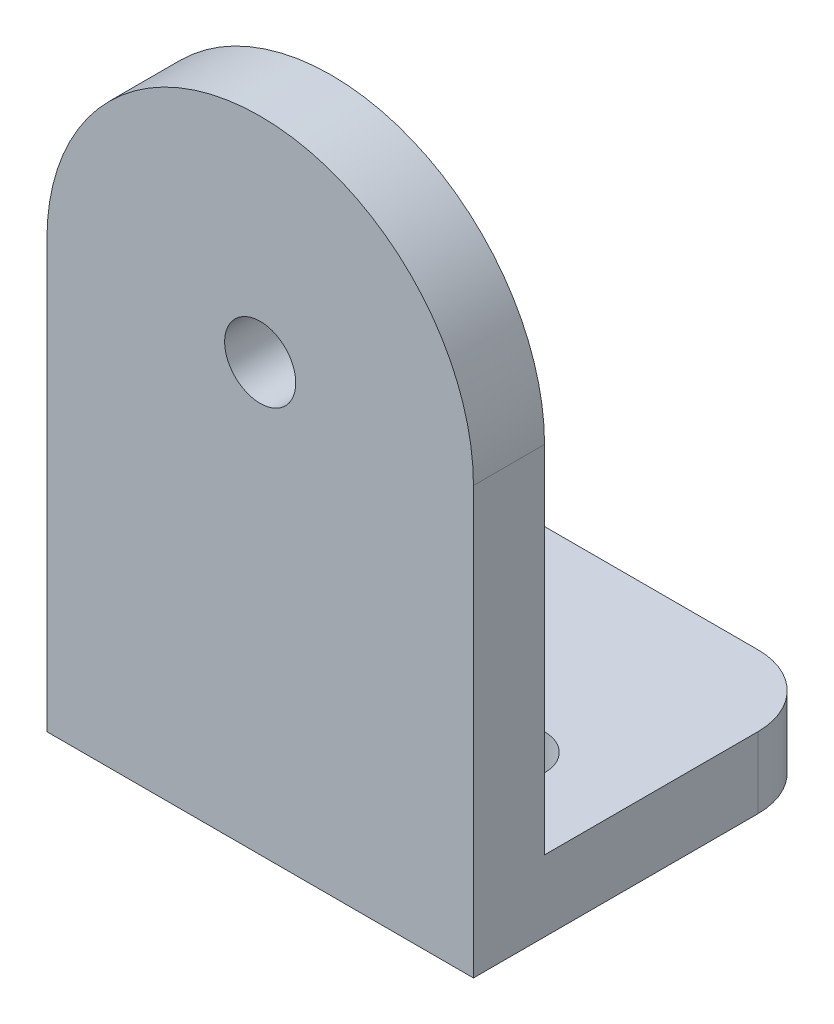
ISO-10303-21;
HEADER;
FILE_DESCRIPTION(('STEP AP214'),'2;1');
FILE_NAME('part.step','',(''),(''),'','','');
FILE_SCHEMA(('AUTOMOTIVE_DESIGN { 1 0 10303 214 1 1 1 1 }'));
ENDSEC;
DATA;
#1=APPLICATION_CONTEXT('core data for automotive mechanical design processes');
#2=APPLICATION_PROTOCOL_DEFINITION('international standard','automotive_design',2000,#1);
#3=PRODUCT_CONTEXT('',#1,'mechanical');
#4=PRODUCT('Part','Part','',(#3));
#5=PRODUCT_RELATED_PRODUCT_CATEGORY('part','',(#4));
#6=PRODUCT_DEFINITION_FORMATION('','',#4);
#7=PRODUCT_DEFINITION_CONTEXT('part definition',#1,'design');
#8=PRODUCT_DEFINITION('design','',#6,#7);
#9=PRODUCT_DEFINITION_SHAPE('','',#8);
#10=(LENGTH_UNIT() NAMED_UNIT(*) SI_UNIT(.MILLI.,.METRE.));
#11=(NAMED_UNIT(*) PLANE_ANGLE_UNIT() SI_UNIT($,.RADIAN.));
#12=(NAMED_UNIT(*) SI_UNIT($,.STERADIAN.) SOLID_ANGLE_UNIT());
#13=UNCERTAINTY_MEASURE_WITH_UNIT(LENGTH_MEASURE(1.E-05),#10,'distance_accuracy_value','');
#14=(GEOMETRIC_REPRESENTATION_CONTEXT(3) GLOBAL_UNCERTAINTY_ASSIGNED_CONTEXT((#13)) GLOBAL_UNIT_ASSIGNED_CONTEXT((#10,
#11,#12)) REPRESENTATION_CONTEXT('',''));
#15=CARTESIAN_POINT('',(0.,0.,0.));
#16=DIRECTION('',(0.,0.,1.));
#17=DIRECTION('',(1.,0.,0.));
#18=AXIS2_PLACEMENT_3D('',#15,#16,#17);
#19=CARTESIAN_POINT('',(-15.9497199849818,7.3015274319225,25.));
#20=DIRECTION('',(0.,0.,1.));
#21=DIRECTION('',(1.,0.,0.));
#22=AXIS2_PLACEMENT_3D('',#19,#20,#21);
#23=PLANE('',#22);
#24=CARTESIAN_POINT('',(-15.9497199849818,7.3015274319225,25.));
#25=DIRECTION('',(0.,0.,1.));
#26=DIRECTION('',(1.,0.,0.));
#27=AXIS2_PLACEMENT_3D('',#24,#25,#26);
#28=CIRCLE('',#27,15.);
#29=CARTESIAN_POINT('',(-0.949719984981778,7.3015274319225,25.));
#30=VERTEX_POINT('',#29);
#31=CARTESIAN_POINT('',(-30.9497199849818,7.3015274319225,25.));
#32=VERTEX_POINT('',#31);
#33=EDGE_CURVE('E146',#30,#32,#28,.T.);
#34=ORIENTED_EDGE('',*,*,#33,.T.);
#35=DIRECTION('',(0.,-1.,0.));
#36=VECTOR('',#35,1.);
#37=CARTESIAN_POINT('',(-30.9497199849818,7.3015274319225,25.));
#38=LINE('',#37,#36);
#39=CARTESIAN_POINT('',(-30.9497199849818,-22.6984725680775,25.));
#40=VERTEX_POINT('',#39);
#41=EDGE_CURVE('E150',#32,#40,#38,.T.);
#42=ORIENTED_EDGE('',*,*,#41,.T.);
#43=DIRECTION('',(1.,0.,0.));
#44=VECTOR('',#43,1.);
#45=CARTESIAN_POINT('',(-30.9497199849818,-22.6984725680775,25.));
#46=LINE('',#45,#44);
#47=CARTESIAN_POINT('',(-0.949719984981778,-22.6984725680775,25.));
#48=VERTEX_POINT('',#47);
#49=EDGE_CURVE('E153',#40,#48,#46,.T.);
#50=ORIENTED_EDGE('',*,*,#49,.T.);
#51=DIRECTION('',(0.,1.,0.));
#52=VECTOR('',#51,1.);
#53=CARTESIAN_POINT('',(-0.949719984981778,-22.6984725680775,25.));
#54=LINE('',#53,#52);
#55=EDGE_CURVE('E156',#48,#30,#54,.T.);
#56=ORIENTED_EDGE('',*,*,#55,.T.);
#57=EDGE_LOOP('',(#34,#42,#50,#56));
#58=FACE_BOUND('',#57,.T.);
#59=CARTESIAN_POINT('',(-15.9497199849818,7.3015274319225,25.));
#60=DIRECTION('',(0.,0.,1.));
#61=DIRECTION('',(1.,0.,0.));
#62=AXIS2_PLACEMENT_3D('',#59,#60,#61);
#63=CIRCLE('',#62,2.5);
#64=CARTESIAN_POINT('',(-13.4497199849818,7.3015274319225,25.));
#65=VERTEX_POINT('',#64);
#66=EDGE_CURVE('E119',#65,#65,#63,.T.);
#67=ORIENTED_EDGE('',*,*,#66,.F.);
#68=EDGE_LOOP('',(#67));
#69=FACE_BOUND('',#68,.T.);
#70=ADVANCED_FACE('F41',(#58,#69),#23,.T.);
#71=CARTESIAN_POINT('',(-15.9497199849818,7.3015274319225,0.));
#72=DIRECTION('',(0.,0.,1.));
#73=DIRECTION('',(1.,0.,0.));
#74=AXIS2_PLACEMENT_3D('',#71,#72,#73);
#75=PLANE('',#74);
#76=DIRECTION('',(1.,0.,0.));
#77=VECTOR('',#76,1.);
#78=CARTESIAN_POINT('',(-30.9497199849818,-22.6984725680775,0.));
#79=LINE('',#78,#77);
#80=CARTESIAN_POINT('',(-25.9497199849818,-22.6984725680775,0.));
#81=VERTEX_POINT('',#80);
#82=CARTESIAN_POINT('',(-5.94971998498179,-22.6984725680775,0.));
#83=VERTEX_POINT('',#82);
#84=EDGE_CURVE('E145',#81,#83,#79,.T.);
#85=ORIENTED_EDGE('',*,*,#84,.F.);
#86=DIRECTION('',(0.,-1.,0.));
#87=VECTOR('',#86,1.);
#88=CARTESIAN_POINT('',(-25.9497199849818,7.3015274319225,0.));
#89=LINE('',#88,#87);
#90=CARTESIAN_POINT('',(-25.9497199849818,-17.6984725680775,0.));
#91=VERTEX_POINT('',#90);
#92=EDGE_CURVE('E195',#81,#91,#89,.F.);
#93=ORIENTED_EDGE('',*,*,#92,.T.);
#94=DIRECTION('',(1.,0.,0.));
#95=VECTOR('',#94,1.);
#96=CARTESIAN_POINT('',(-47.,-17.6984725680775,0.));
#97=LINE('',#96,#95);
#98=CARTESIAN_POINT('',(-5.94971998498178,-17.6984725680775,0.));
#99=VERTEX_POINT('',#98);
#100=EDGE_CURVE('E128',#91,#99,#97,.T.);
#101=ORIENTED_EDGE('',*,*,#100,.T.);
#102=DIRECTION('',(0.,1.,0.));
#103=VECTOR('',#102,1.);
#104=CARTESIAN_POINT('',(-5.94971998498178,7.3015274319225,0.));
#105=LINE('',#104,#103);
#106=EDGE_CURVE('E192',#99,#83,#105,.F.);
#107=ORIENTED_EDGE('',*,*,#106,.T.);
#108=EDGE_LOOP('',(#85,#93,#101,#107));
#109=FACE_BOUND('',#108,.T.);
#110=ADVANCED_FACE('F238',(#109),#75,.F.);
#111=CARTESIAN_POINT('',(-15.9497199849818,7.3015274319225,25.));
#112=DIRECTION('',(0.,0.,-1.));
#113=DIRECTION('',(-1.,0.,0.));
#114=AXIS2_PLACEMENT_3D('',#111,#112,#113);
#115=CYLINDRICAL_SURFACE('',#114,15.);
#116=DIRECTION('',(0.,0.,-1.));
#117=VECTOR('',#116,1.);
#118=CARTESIAN_POINT('',(-0.949719984981778,7.3015274319225,25.));
#119=LINE('',#118,#117);
#120=CARTESIAN_POINT('',(-0.949719984981778,7.3015274319225,20.));
#121=VERTEX_POINT('',#120);
#122=EDGE_CURVE('E159',#30,#121,#119,.T.);
#123=ORIENTED_EDGE('',*,*,#122,.T.);
#124=CARTESIAN_POINT('',(-15.9497199849818,7.3015274319225,20.));
#125=DIRECTION('',(0.,0.,1.));
#126=DIRECTION('',(1.,0.,0.));
#127=AXIS2_PLACEMENT_3D('',#124,#125,#126);
#128=CIRCLE('',#127,15.);
#129=CARTESIAN_POINT('',(-30.9497199849818,7.3015274319225,20.));
#130=VERTEX_POINT('',#129);
#131=EDGE_CURVE('E136',#121,#130,#128,.T.);
#132=ORIENTED_EDGE('',*,*,#131,.T.);
#133=DIRECTION('',(0.,0.,-1.));
#134=VECTOR('',#133,1.);
#135=CARTESIAN_POINT('',(-30.9497199849818,7.3015274319225,25.));
#136=LINE('',#135,#134);
#137=EDGE_CURVE('E134',#32,#130,#136,.T.);
#138=ORIENTED_EDGE('',*,*,#137,.F.);
#139=ORIENTED_EDGE('',*,*,#33,.F.);
#140=EDGE_LOOP('',(#123,#132,#138,#139));
#141=FACE_BOUND('',#140,.T.);
#142=ADVANCED_FACE('F226',(#141),#115,.T.);
#143=CARTESIAN_POINT('',(-30.9497199849818,7.3015274319225,25.));
#144=DIRECTION('',(1.,0.,0.));
#145=DIRECTION('',(0.,0.,-1.));
#146=AXIS2_PLACEMENT_3D('',#143,#144,#145);
#147=PLANE('',#146);
#148=DIRECTION('',(0.,0.,-1.));
#149=VECTOR('',#148,1.);
#150=CARTESIAN_POINT('',(-30.9497199849818,-17.6984725680775,25.));
#151=LINE('',#150,#149);
#152=CARTESIAN_POINT('',(-30.9497199849818,-17.6984725680775,20.));
#153=VERTEX_POINT('',#152);
#154=CARTESIAN_POINT('',(-30.9497199849818,-17.6984725680775,5.));
#155=VERTEX_POINT('',#154);
#156=EDGE_CURVE('E108',#153,#155,#151,.T.);
#157=ORIENTED_EDGE('',*,*,#156,.T.);
#158=DIRECTION('',(0.,-1.,0.));
#159=VECTOR('',#158,1.);
#160=CARTESIAN_POINT('',(-30.9497199849818,7.3015274319225,5.));
#161=LINE('',#160,#159);
#162=CARTESIAN_POINT('',(-30.9497199849818,-22.6984725680775,5.));
#163=VERTEX_POINT('',#162);
#164=EDGE_CURVE('E183',#155,#163,#161,.T.);
#165=ORIENTED_EDGE('',*,*,#164,.T.);
#166=DIRECTION('',(0.,0.,-1.));
#167=VECTOR('',#166,1.);
#168=CARTESIAN_POINT('',(-30.9497199849818,-22.6984725680775,25.));
#169=LINE('',#168,#167);
#170=EDGE_CURVE('E170',#40,#163,#169,.T.);
#171=ORIENTED_EDGE('',*,*,#170,.F.);
#172=ORIENTED_EDGE('',*,*,#41,.F.);
#173=ORIENTED_EDGE('',*,*,#137,.T.);
#174=DIRECTION('',(0.,-1.,0.));
#175=VECTOR('',#174,1.);
#176=CARTESIAN_POINT('',(-30.9497199849818,7.3015274319225,20.));
#177=LINE('',#176,#175);
#178=EDGE_CURVE('E120',#130,#153,#177,.T.);
#179=ORIENTED_EDGE('',*,*,#178,.T.);
#180=EDGE_LOOP('',(#157,#165,#171,#172,#173,#179));
#181=FACE_BOUND('',#180,.T.);
#182=ADVANCED_FACE('F132',(#181),#147,.F.);
#183=CARTESIAN_POINT('',(-30.9497199849818,-22.6984725680775,25.));
#184=DIRECTION('',(0.,1.,0.));
#185=DIRECTION('',(0.,0.,1.));
#186=AXIS2_PLACEMENT_3D('',#183,#184,#185);
#187=PLANE('',#186);
#188=CARTESIAN_POINT('',(-23.4497199849818,-22.6984725680775,15.));
#189=DIRECTION('',(0.,1.,0.));
#190=DIRECTION('',(0.,0.,1.));
#191=AXIS2_PLACEMENT_3D('',#188,#189,#190);
#192=CIRCLE('',#191,2.5);
#193=CARTESIAN_POINT('',(-23.4497199849818,-22.6984725680775,17.5));
#194=VERTEX_POINT('',#193);
#195=EDGE_CURVE('E129',#194,#194,#192,.T.);
#196=ORIENTED_EDGE('',*,*,#195,.T.);
#197=EDGE_LOOP('',(#196));
#198=FACE_BOUND('',#197,.T.);
#199=CARTESIAN_POINT('',(-8.44971998498178,-22.6984725680775,15.));
#200=DIRECTION('',(0.,1.,0.));
#201=DIRECTION('',(0.,0.,1.));
#202=AXIS2_PLACEMENT_3D('',#199,#200,#201);
#203=CIRCLE('',#202,2.5);
#204=CARTESIAN_POINT('',(-8.44971998498178,-22.6984725680775,17.5));
#205=VERTEX_POINT('',#204);
#206=EDGE_CURVE('E204',#205,#205,#203,.T.);
#207=ORIENTED_EDGE('',*,*,#206,.T.);
#208=EDGE_LOOP('',(#207));
#209=FACE_BOUND('',#208,.T.);
#210=ORIENTED_EDGE('',*,*,#170,.T.);
#211=CARTESIAN_POINT('',(-25.9497199849818,-22.6984725680775,5.));
#212=DIRECTION('',(0.,1.,0.));
#213=DIRECTION('',(0.,0.,1.));
#214=AXIS2_PLACEMENT_3D('',#211,#212,#213);
#215=CIRCLE('',#214,5.);
#216=EDGE_CURVE('E189',#163,#81,#215,.F.);
#217=ORIENTED_EDGE('',*,*,#216,.T.);
#218=ORIENTED_EDGE('',*,*,#84,.T.);
#219=CARTESIAN_POINT('',(-5.94971998498178,-22.6984725680775,5.));
#220=DIRECTION('',(0.,1.,0.));
#221=DIRECTION('',(0.,0.,1.));
#222=AXIS2_PLACEMENT_3D('',#219,#220,#221);
#223=CIRCLE('',#222,5.);
#224=CARTESIAN_POINT('',(-0.949719984981778,-22.6984725680775,5.));
#225=VERTEX_POINT('',#224);
#226=EDGE_CURVE('E186',#83,#225,#223,.F.);
#227=ORIENTED_EDGE('',*,*,#226,.T.);
#228=DIRECTION('',(0.,0.,-1.));
#229=VECTOR('',#228,1.);
#230=CARTESIAN_POINT('',(-0.949719984981778,-22.6984725680775,25.));
#231=LINE('',#230,#229);
#232=EDGE_CURVE('E166',#48,#225,#231,.T.);
#233=ORIENTED_EDGE('',*,*,#232,.F.);
#234=ORIENTED_EDGE('',*,*,#49,.F.);
#235=EDGE_LOOP('',(#210,#217,#218,#227,#233,#234));
#236=FACE_BOUND('',#235,.T.);
#237=ADVANCED_FACE('F234',(#198,#209,#236),#187,.F.);
#238=CARTESIAN_POINT('',(-0.949719984981778,-22.6984725680775,25.));
#239=DIRECTION('',(-1.,0.,0.));
#240=DIRECTION('',(0.,0.,1.));
#241=AXIS2_PLACEMENT_3D('',#238,#239,#240);
#242=PLANE('',#241);
#243=ORIENTED_EDGE('',*,*,#232,.T.);
#244=DIRECTION('',(0.,1.,0.));
#245=VECTOR('',#244,1.);
#246=CARTESIAN_POINT('',(-0.949719984981778,-22.6984725680775,5.));
#247=LINE('',#246,#245);
#248=CARTESIAN_POINT('',(-0.949719984981778,-17.6984725680775,5.));
#249=VERTEX_POINT('',#248);
#250=EDGE_CURVE('E11',#225,#249,#247,.T.);
#251=ORIENTED_EDGE('',*,*,#250,.T.);
#252=DIRECTION('',(0.,0.,1.));
#253=VECTOR('',#252,1.);
#254=CARTESIAN_POINT('',(-0.949719984981778,-17.6984725680775,25.));
#255=LINE('',#254,#253);
#256=CARTESIAN_POINT('',(-0.949719984981778,-17.6984725680775,20.));
#257=VERTEX_POINT('',#256);
#258=EDGE_CURVE('E176',#249,#257,#255,.T.);
#259=ORIENTED_EDGE('',*,*,#258,.T.);
#260=DIRECTION('',(0.,1.,0.));
#261=VECTOR('',#260,1.);
#262=CARTESIAN_POINT('',(-0.949719984981778,-22.6984725680775,20.));
#263=LINE('',#262,#261);
#264=EDGE_CURVE('E126',#257,#121,#263,.T.);
#265=ORIENTED_EDGE('',*,*,#264,.T.);
#266=ORIENTED_EDGE('',*,*,#122,.F.);
#267=ORIENTED_EDGE('',*,*,#55,.F.);
#268=EDGE_LOOP('',(#243,#251,#259,#265,#266,#267));
#269=FACE_BOUND('',#268,.T.);
#270=ADVANCED_FACE('F222',(#269),#242,.F.);
#271=CARTESIAN_POINT('',(-15.9497199849818,7.3015274319225,25.));
#272=DIRECTION('',(0.,0.,-1.));
#273=DIRECTION('',(-1.,0.,0.));
#274=AXIS2_PLACEMENT_3D('',#271,#272,#273);
#275=CYLINDRICAL_SURFACE('',#274,2.5);
#276=CARTESIAN_POINT('',(-15.9497199849818,7.3015274319225,20.));
#277=DIRECTION('',(0.,0.,1.));
#278=DIRECTION('',(1.,0.,0.));
#279=AXIS2_PLACEMENT_3D('',#276,#277,#278);
#280=CIRCLE('',#279,2.5);
#281=CARTESIAN_POINT('',(-13.4497199849818,7.3015274319225,20.));
#282=VERTEX_POINT('',#281);
#283=EDGE_CURVE('E177',#282,#282,#280,.T.);
#284=ORIENTED_EDGE('',*,*,#283,.F.);
#285=EDGE_LOOP('',(#284));
#286=FACE_BOUND('',#285,.T.);
#287=ORIENTED_EDGE('',*,*,#66,.T.);
#288=EDGE_LOOP('',(#287));
#289=FACE_BOUND('',#288,.T.);
#290=ADVANCED_FACE('F257',(#286,#289),#275,.F.);
#291=CARTESIAN_POINT('',(-47.,-17.6984725680775,20.));
#292=DIRECTION('',(0.,-1.,0.));
#293=DIRECTION('',(0.,0.,-1.));
#294=AXIS2_PLACEMENT_3D('',#291,#292,#293);
#295=PLANE('',#294);
#296=CARTESIAN_POINT('',(-23.4497199849818,-17.6984725680775,15.));
#297=DIRECTION('',(0.,-1.,0.));
#298=DIRECTION('',(0.,0.,-1.));
#299=AXIS2_PLACEMENT_3D('',#296,#297,#298);
#300=CIRCLE('',#299,2.5);
#301=CARTESIAN_POINT('',(-23.4497199849818,-17.6984725680775,12.5));
#302=VERTEX_POINT('',#301);
#303=EDGE_CURVE('E45',#302,#302,#300,.T.);
#304=ORIENTED_EDGE('',*,*,#303,.T.);
#305=EDGE_LOOP('',(#304));
#306=FACE_BOUND('',#305,.T.);
#307=CARTESIAN_POINT('',(-8.44971998498178,-17.6984725680775,15.));
#308=DIRECTION('',(0.,-1.,0.));
#309=DIRECTION('',(0.,0.,-1.));
#310=AXIS2_PLACEMENT_3D('',#307,#308,#309);
#311=CIRCLE('',#310,2.5);
#312=CARTESIAN_POINT('',(-8.44971998498178,-17.6984725680775,12.5));
#313=VERTEX_POINT('',#312);
#314=EDGE_CURVE('E201',#313,#313,#311,.T.);
#315=ORIENTED_EDGE('',*,*,#314,.T.);
#316=EDGE_LOOP('',(#315));
#317=FACE_BOUND('',#316,.T.);
#318=ORIENTED_EDGE('',*,*,#100,.F.);
#319=CARTESIAN_POINT('',(-25.9497199849818,-17.6984725680775,5.));
#320=DIRECTION('',(0.,-1.,0.));
#321=DIRECTION('',(0.,0.,-1.));
#322=AXIS2_PLACEMENT_3D('',#319,#320,#321);
#323=CIRCLE('',#322,5.);
#324=EDGE_CURVE('E51',#91,#155,#323,.F.);
#325=ORIENTED_EDGE('',*,*,#324,.T.);
#326=ORIENTED_EDGE('',*,*,#156,.F.);
#327=DIRECTION('',(1.,0.,0.));
#328=VECTOR('',#327,1.);
#329=CARTESIAN_POINT('',(-47.,-17.6984725680775,20.));
#330=LINE('',#329,#328);
#331=EDGE_CURVE('E111',#153,#257,#330,.T.);
#332=ORIENTED_EDGE('',*,*,#331,.T.);
#333=ORIENTED_EDGE('',*,*,#258,.F.);
#334=CARTESIAN_POINT('',(-5.94971998498178,-17.6984725680775,5.));
#335=DIRECTION('',(0.,-1.,0.));
#336=DIRECTION('',(0.,0.,-1.));
#337=AXIS2_PLACEMENT_3D('',#334,#335,#336);
#338=CIRCLE('',#337,5.);
#339=EDGE_CURVE('E59',#249,#99,#338,.F.);
#340=ORIENTED_EDGE('',*,*,#339,.T.);
#341=EDGE_LOOP('',(#318,#325,#326,#332,#333,#340));
#342=FACE_BOUND('',#341,.T.);
#343=ADVANCED_FACE('F110',(#306,#317,#342),#295,.F.);
#344=CARTESIAN_POINT('',(-47.,-17.6984725680775,20.));
#345=DIRECTION('',(0.,0.,1.));
#346=DIRECTION('',(1.,0.,0.));
#347=AXIS2_PLACEMENT_3D('',#344,#345,#346);
#348=PLANE('',#347);
#349=ORIENTED_EDGE('',*,*,#283,.T.);
#350=EDGE_LOOP('',(#349));
#351=FACE_BOUND('',#350,.T.);
#352=ORIENTED_EDGE('',*,*,#131,.F.);
#353=ORIENTED_EDGE('',*,*,#264,.F.);
#354=ORIENTED_EDGE('',*,*,#331,.F.);
#355=ORIENTED_EDGE('',*,*,#178,.F.);
#356=EDGE_LOOP('',(#352,#353,#354,#355));
#357=FACE_BOUND('',#356,.T.);
#358=ADVANCED_FACE('F123',(#351,#357),#348,.F.);
#359=CARTESIAN_POINT('',(-25.9497199849818,7.3015274319225,5.));
#360=DIRECTION('',(0.,-1.,0.));
#361=DIRECTION('',(0.,0.,-1.));
#362=AXIS2_PLACEMENT_3D('',#359,#360,#361);
#363=CYLINDRICAL_SURFACE('',#362,5.);
#364=ORIENTED_EDGE('',*,*,#324,.F.);
#365=ORIENTED_EDGE('',*,*,#92,.F.);
#366=ORIENTED_EDGE('',*,*,#216,.F.);
#367=ORIENTED_EDGE('',*,*,#164,.F.);
#368=EDGE_LOOP('',(#364,#365,#366,#367));
#369=FACE_BOUND('',#368,.T.);
#370=ADVANCED_FACE('F240',(#369),#363,.T.);
#371=CARTESIAN_POINT('',(-5.94971998498178,-22.6984725680775,5.));
#372=DIRECTION('',(0.,1.,0.));
#373=DIRECTION('',(0.,0.,1.));
#374=AXIS2_PLACEMENT_3D('',#371,#372,#373);
#375=CYLINDRICAL_SURFACE('',#374,5.);
#376=ORIENTED_EDGE('',*,*,#226,.F.);
#377=ORIENTED_EDGE('',*,*,#106,.F.);
#378=ORIENTED_EDGE('',*,*,#339,.F.);
#379=ORIENTED_EDGE('',*,*,#250,.F.);
#380=EDGE_LOOP('',(#376,#377,#378,#379));
#381=FACE_BOUND('',#380,.T.);
#382=ADVANCED_FACE('F43',(#381),#375,.T.);
#383=CARTESIAN_POINT('',(-8.44971998498178,-47.,15.));
#384=DIRECTION('',(0.,1.,0.));
#385=DIRECTION('',(0.,0.,1.));
#386=AXIS2_PLACEMENT_3D('',#383,#384,#385);
#387=CYLINDRICAL_SURFACE('',#386,2.5);
#388=ORIENTED_EDGE('',*,*,#314,.F.);
#389=EDGE_LOOP('',(#388));
#390=FACE_BOUND('',#389,.T.);
#391=ORIENTED_EDGE('',*,*,#206,.F.);
#392=EDGE_LOOP('',(#391));
#393=FACE_BOUND('',#392,.T.);
#394=ADVANCED_FACE('F246',(#390,#393),#387,.F.);
#395=CARTESIAN_POINT('',(-23.4497199849818,-47.,15.));
#396=DIRECTION('',(0.,1.,0.));
#397=DIRECTION('',(0.,0.,1.));
#398=AXIS2_PLACEMENT_3D('',#395,#396,#397);
#399=CYLINDRICAL_SURFACE('',#398,2.5);
#400=ORIENTED_EDGE('',*,*,#303,.F.);
#401=EDGE_LOOP('',(#400));
#402=FACE_BOUND('',#401,.T.);
#403=ORIENTED_EDGE('',*,*,#195,.F.);
#404=EDGE_LOOP('',(#403));
#405=FACE_BOUND('',#404,.T.);
#406=ADVANCED_FACE('F330',(#402,#405),#399,.F.);
#407=CLOSED_SHELL('',(#70,#110,#142,#182,#237,#270,#290,#343,#358,#370,#382,#394,#406));
#408=MANIFOLD_SOLID_BREP('B2',#407);
#409=ADVANCED_BREP_SHAPE_REPRESENTATION('',(#18,#408),#14);
#410=SHAPE_DEFINITION_REPRESENTATION(#9,#409);
ENDSEC;
END-ISO-10303-21;
